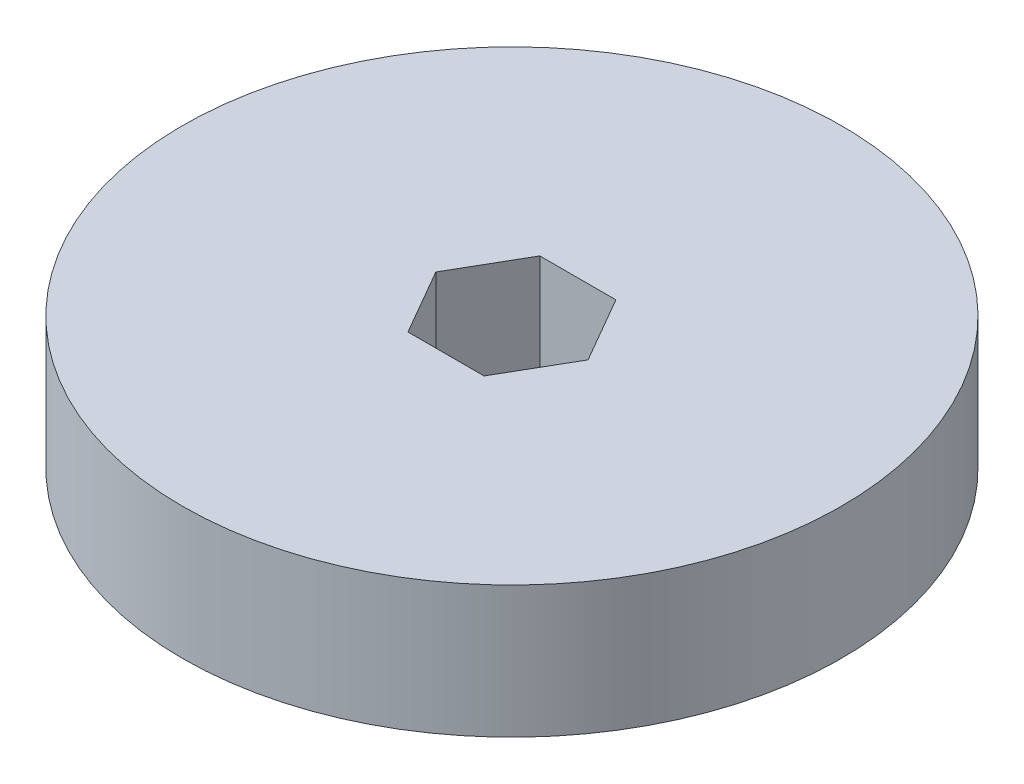
ISO-10303-21;
HEADER;
FILE_DESCRIPTION(('STEP AP214'),'2;1');
FILE_NAME('part.step','',(''),(''),'','','');
FILE_SCHEMA(('AUTOMOTIVE_DESIGN { 1 0 10303 214 1 1 1 1 }'));
ENDSEC;
DATA;
#1=APPLICATION_CONTEXT('core data for automotive mechanical design processes');
#2=APPLICATION_PROTOCOL_DEFINITION('international standard','automotive_design',2000,#1);
#3=PRODUCT_CONTEXT('',#1,'mechanical');
#4=PRODUCT('Part','Part','',(#3));
#5=PRODUCT_RELATED_PRODUCT_CATEGORY('part','',(#4));
#6=PRODUCT_DEFINITION_FORMATION('','',#4);
#7=PRODUCT_DEFINITION_CONTEXT('part definition',#1,'design');
#8=PRODUCT_DEFINITION('design','',#6,#7);
#9=PRODUCT_DEFINITION_SHAPE('','',#8);
#10=(LENGTH_UNIT() NAMED_UNIT(*) SI_UNIT(.MILLI.,.METRE.));
#11=(NAMED_UNIT(*) PLANE_ANGLE_UNIT() SI_UNIT($,.RADIAN.));
#12=(NAMED_UNIT(*) SI_UNIT($,.STERADIAN.) SOLID_ANGLE_UNIT());
#13=UNCERTAINTY_MEASURE_WITH_UNIT(LENGTH_MEASURE(1.E-05),#10,'distance_accuracy_value','');
#14=(GEOMETRIC_REPRESENTATION_CONTEXT(3) GLOBAL_UNCERTAINTY_ASSIGNED_CONTEXT((#13)) GLOBAL_UNIT_ASSIGNED_CONTEXT((#10,
#11,#12)) REPRESENTATION_CONTEXT('',''));
#15=CARTESIAN_POINT('',(0.,0.,0.));
#16=DIRECTION('',(0.,0.,1.));
#17=DIRECTION('',(1.,0.,0.));
#18=AXIS2_PLACEMENT_3D('',#15,#16,#17);
#19=CARTESIAN_POINT('',(0.,12.7,0.));
#20=DIRECTION('',(0.,1.,0.));
#21=DIRECTION('',(0.,0.,1.));
#22=AXIS2_PLACEMENT_3D('',#19,#20,#21);
#23=PLANE('',#22);
#24=CARTESIAN_POINT('',(0.,12.7,0.));
#25=DIRECTION('',(0.,1.,0.));
#26=DIRECTION('',(0.,0.,1.));
#27=AXIS2_PLACEMENT_3D('',#24,#25,#26);
#28=CIRCLE('',#27,31.75);
#29=CARTESIAN_POINT('',(0.,12.7,31.75));
#30=VERTEX_POINT('',#29);
#31=EDGE_CURVE('E11',#30,#30,#28,.T.);
#32=ORIENTED_EDGE('',*,*,#31,.T.);
#33=EDGE_LOOP('',(#32));
#34=FACE_BOUND('',#33,.T.);
#35=DIRECTION('',(0.5,0.,0.866025403784439));
#36=VECTOR('',#35,1.);
#37=CARTESIAN_POINT('',(-7.33234841870825,12.7,0.));
#38=LINE('',#37,#36);
#39=CARTESIAN_POINT('',(-7.33234841870825,12.7,0.));
#40=VERTEX_POINT('',#39);
#41=CARTESIAN_POINT('',(-3.66617420935413,12.7,6.35));
#42=VERTEX_POINT('',#41);
#43=EDGE_CURVE('E93',#40,#42,#38,.T.);
#44=ORIENTED_EDGE('',*,*,#43,.F.);
#45=DIRECTION('',(-0.5,0.,0.866025403784439));
#46=VECTOR('',#45,1.);
#47=CARTESIAN_POINT('',(-3.66617420935413,12.7,-6.35));
#48=LINE('',#47,#46);
#49=CARTESIAN_POINT('',(-3.66617420935413,12.7,-6.35));
#50=VERTEX_POINT('',#49);
#51=EDGE_CURVE('E85',#50,#40,#48,.T.);
#52=ORIENTED_EDGE('',*,*,#51,.F.);
#53=DIRECTION('',(-1.,0.,0.));
#54=VECTOR('',#53,1.);
#55=CARTESIAN_POINT('',(3.66617420935412,12.7,-6.35));
#56=LINE('',#55,#54);
#57=CARTESIAN_POINT('',(3.66617420935412,12.7,-6.35));
#58=VERTEX_POINT('',#57);
#59=EDGE_CURVE('E113',#58,#50,#56,.T.);
#60=ORIENTED_EDGE('',*,*,#59,.F.);
#61=DIRECTION('',(-0.5,0.,-0.866025403784439));
#62=VECTOR('',#61,1.);
#63=CARTESIAN_POINT('',(7.33234841870824,12.7,0.));
#64=LINE('',#63,#62);
#65=CARTESIAN_POINT('',(7.33234841870824,12.7,0.));
#66=VERTEX_POINT('',#65);
#67=EDGE_CURVE('E111',#66,#58,#64,.T.);
#68=ORIENTED_EDGE('',*,*,#67,.F.);
#69=DIRECTION('',(0.5,0.,-0.866025403784439));
#70=VECTOR('',#69,1.);
#71=CARTESIAN_POINT('',(3.66617420935412,12.7,6.35));
#72=LINE('',#71,#70);
#73=CARTESIAN_POINT('',(3.66617420935412,12.7,6.35));
#74=VERTEX_POINT('',#73);
#75=EDGE_CURVE('E107',#74,#66,#72,.T.);
#76=ORIENTED_EDGE('',*,*,#75,.F.);
#77=DIRECTION('',(1.,0.,0.));
#78=VECTOR('',#77,1.);
#79=CARTESIAN_POINT('',(-3.66617420935413,12.7,6.35));
#80=LINE('',#79,#78);
#81=EDGE_CURVE('E105',#42,#74,#80,.T.);
#82=ORIENTED_EDGE('',*,*,#81,.F.);
#83=EDGE_LOOP('',(#44,#52,#60,#68,#76,#82));
#84=FACE_BOUND('',#83,.T.);
#85=ADVANCED_FACE('F32',(#34,#84),#23,.T.);
#86=CARTESIAN_POINT('',(0.,0.,0.));
#87=DIRECTION('',(0.,1.,0.));
#88=DIRECTION('',(0.,0.,1.));
#89=AXIS2_PLACEMENT_3D('',#86,#87,#88);
#90=PLANE('',#89);
#91=CARTESIAN_POINT('',(0.,0.,0.));
#92=DIRECTION('',(0.,1.,0.));
#93=DIRECTION('',(0.,0.,1.));
#94=AXIS2_PLACEMENT_3D('',#91,#92,#93);
#95=CIRCLE('',#94,31.75);
#96=CARTESIAN_POINT('',(0.,0.,31.75));
#97=VERTEX_POINT('',#96);
#98=EDGE_CURVE('E36',#97,#97,#95,.T.);
#99=ORIENTED_EDGE('',*,*,#98,.F.);
#100=EDGE_LOOP('',(#99));
#101=FACE_BOUND('',#100,.T.);
#102=DIRECTION('',(-0.5,0.,0.866025403784439));
#103=VECTOR('',#102,1.);
#104=CARTESIAN_POINT('',(-3.66617420935413,0.,-6.35));
#105=LINE('',#104,#103);
#106=CARTESIAN_POINT('',(-3.66617420935413,0.,-6.35));
#107=VERTEX_POINT('',#106);
#108=CARTESIAN_POINT('',(-7.33234841870825,0.,0.));
#109=VERTEX_POINT('',#108);
#110=EDGE_CURVE('E55',#107,#109,#105,.T.);
#111=ORIENTED_EDGE('',*,*,#110,.T.);
#112=DIRECTION('',(0.5,0.,0.866025403784439));
#113=VECTOR('',#112,1.);
#114=CARTESIAN_POINT('',(-7.33234841870825,0.,0.));
#115=LINE('',#114,#113);
#116=CARTESIAN_POINT('',(-3.66617420935413,0.,6.35));
#117=VERTEX_POINT('',#116);
#118=EDGE_CURVE('E100',#109,#117,#115,.T.);
#119=ORIENTED_EDGE('',*,*,#118,.T.);
#120=DIRECTION('',(1.,0.,0.));
#121=VECTOR('',#120,1.);
#122=CARTESIAN_POINT('',(-3.66617420935413,0.,6.35));
#123=LINE('',#122,#121);
#124=CARTESIAN_POINT('',(3.66617420935412,0.,6.35));
#125=VERTEX_POINT('',#124);
#126=EDGE_CURVE('E117',#117,#125,#123,.T.);
#127=ORIENTED_EDGE('',*,*,#126,.T.);
#128=DIRECTION('',(0.5,0.,-0.866025403784439));
#129=VECTOR('',#128,1.);
#130=CARTESIAN_POINT('',(3.66617420935412,0.,6.35));
#131=LINE('',#130,#129);
#132=CARTESIAN_POINT('',(7.33234841870824,0.,0.));
#133=VERTEX_POINT('',#132);
#134=EDGE_CURVE('E120',#125,#133,#131,.T.);
#135=ORIENTED_EDGE('',*,*,#134,.T.);
#136=DIRECTION('',(-0.5,0.,-0.866025403784439));
#137=VECTOR('',#136,1.);
#138=CARTESIAN_POINT('',(7.33234841870824,0.,0.));
#139=LINE('',#138,#137);
#140=CARTESIAN_POINT('',(3.66617420935412,0.,-6.35));
#141=VERTEX_POINT('',#140);
#142=EDGE_CURVE('E123',#133,#141,#139,.T.);
#143=ORIENTED_EDGE('',*,*,#142,.T.);
#144=DIRECTION('',(-1.,0.,0.));
#145=VECTOR('',#144,1.);
#146=CARTESIAN_POINT('',(3.66617420935412,0.,-6.35));
#147=LINE('',#146,#145);
#148=EDGE_CURVE('E94',#141,#107,#147,.T.);
#149=ORIENTED_EDGE('',*,*,#148,.T.);
#150=EDGE_LOOP('',(#111,#119,#127,#135,#143,#149));
#151=FACE_BOUND('',#150,.T.);
#152=ADVANCED_FACE('F140',(#101,#151),#90,.F.);
#153=CARTESIAN_POINT('',(0.,12.7,0.));
#154=DIRECTION('',(0.,-1.,0.));
#155=DIRECTION('',(0.,0.,-1.));
#156=AXIS2_PLACEMENT_3D('',#153,#154,#155);
#157=CYLINDRICAL_SURFACE('',#156,31.75);
#158=ORIENTED_EDGE('',*,*,#31,.F.);
#159=EDGE_LOOP('',(#158));
#160=FACE_BOUND('',#159,.T.);
#161=ORIENTED_EDGE('',*,*,#98,.T.);
#162=EDGE_LOOP('',(#161));
#163=FACE_BOUND('',#162,.T.);
#164=ADVANCED_FACE('F34',(#160,#163),#157,.T.);
#165=CARTESIAN_POINT('',(-3.66617420935413,12.7,-6.35));
#166=DIRECTION('',(0.866025403784439,0.,0.5));
#167=DIRECTION('',(0.5,0.,-0.866025403784439));
#168=AXIS2_PLACEMENT_3D('',#165,#166,#167);
#169=PLANE('',#168);
#170=ORIENTED_EDGE('',*,*,#110,.F.);
#171=DIRECTION('',(0.,-1.,0.));
#172=VECTOR('',#171,1.);
#173=CARTESIAN_POINT('',(-3.66617420935413,12.7,-6.35));
#174=LINE('',#173,#172);
#175=EDGE_CURVE('E89',#50,#107,#174,.T.);
#176=ORIENTED_EDGE('',*,*,#175,.F.);
#177=ORIENTED_EDGE('',*,*,#51,.T.);
#178=DIRECTION('',(0.,-1.,0.));
#179=VECTOR('',#178,1.);
#180=CARTESIAN_POINT('',(-7.33234841870825,12.7,0.));
#181=LINE('',#180,#179);
#182=EDGE_CURVE('E88',#40,#109,#181,.T.);
#183=ORIENTED_EDGE('',*,*,#182,.T.);
#184=EDGE_LOOP('',(#170,#176,#177,#183));
#185=FACE_BOUND('',#184,.T.);
#186=ADVANCED_FACE('F87',(#185),#169,.T.);
#187=CARTESIAN_POINT('',(-7.33234841870825,12.7,0.));
#188=DIRECTION('',(0.866025403784439,0.,-0.5));
#189=DIRECTION('',(-0.5,0.,-0.866025403784439));
#190=AXIS2_PLACEMENT_3D('',#187,#188,#189);
#191=PLANE('',#190);
#192=ORIENTED_EDGE('',*,*,#118,.F.);
#193=ORIENTED_EDGE('',*,*,#182,.F.);
#194=ORIENTED_EDGE('',*,*,#43,.T.);
#195=DIRECTION('',(0.,-1.,0.));
#196=VECTOR('',#195,1.);
#197=CARTESIAN_POINT('',(-3.66617420935413,12.7,6.35));
#198=LINE('',#197,#196);
#199=EDGE_CURVE('E101',#42,#117,#198,.T.);
#200=ORIENTED_EDGE('',*,*,#199,.T.);
#201=EDGE_LOOP('',(#192,#193,#194,#200));
#202=FACE_BOUND('',#201,.T.);
#203=ADVANCED_FACE('F97',(#202),#191,.T.);
#204=CARTESIAN_POINT('',(-3.66617420935413,12.7,6.35));
#205=DIRECTION('',(0.,0.,-1.));
#206=DIRECTION('',(-1.,0.,0.));
#207=AXIS2_PLACEMENT_3D('',#204,#205,#206);
#208=PLANE('',#207);
#209=ORIENTED_EDGE('',*,*,#126,.F.);
#210=ORIENTED_EDGE('',*,*,#199,.F.);
#211=ORIENTED_EDGE('',*,*,#81,.T.);
#212=DIRECTION('',(0.,-1.,0.));
#213=VECTOR('',#212,1.);
#214=CARTESIAN_POINT('',(3.66617420935412,12.7,6.35));
#215=LINE('',#214,#213);
#216=EDGE_CURVE('E132',#74,#125,#215,.T.);
#217=ORIENTED_EDGE('',*,*,#216,.T.);
#218=EDGE_LOOP('',(#209,#210,#211,#217));
#219=FACE_BOUND('',#218,.T.);
#220=ADVANCED_FACE('F136',(#219),#208,.T.);
#221=CARTESIAN_POINT('',(3.66617420935412,12.7,6.35));
#222=DIRECTION('',(-0.866025403784439,0.,-0.5));
#223=DIRECTION('',(-0.5,0.,0.866025403784439));
#224=AXIS2_PLACEMENT_3D('',#221,#222,#223);
#225=PLANE('',#224);
#226=ORIENTED_EDGE('',*,*,#134,.F.);
#227=ORIENTED_EDGE('',*,*,#216,.F.);
#228=ORIENTED_EDGE('',*,*,#75,.T.);
#229=DIRECTION('',(0.,-1.,0.));
#230=VECTOR('',#229,1.);
#231=CARTESIAN_POINT('',(7.33234841870824,12.7,0.));
#232=LINE('',#231,#230);
#233=EDGE_CURVE('E130',#66,#133,#232,.T.);
#234=ORIENTED_EDGE('',*,*,#233,.T.);
#235=EDGE_LOOP('',(#226,#227,#228,#234));
#236=FACE_BOUND('',#235,.T.);
#237=ADVANCED_FACE('F148',(#236),#225,.T.);
#238=CARTESIAN_POINT('',(7.33234841870824,12.7,0.));
#239=DIRECTION('',(-0.866025403784439,0.,0.5));
#240=DIRECTION('',(0.5,0.,0.866025403784439));
#241=AXIS2_PLACEMENT_3D('',#238,#239,#240);
#242=PLANE('',#241);
#243=ORIENTED_EDGE('',*,*,#142,.F.);
#244=ORIENTED_EDGE('',*,*,#233,.F.);
#245=ORIENTED_EDGE('',*,*,#67,.T.);
#246=DIRECTION('',(0.,-1.,0.));
#247=VECTOR('',#246,1.);
#248=CARTESIAN_POINT('',(3.66617420935412,12.7,-6.35));
#249=LINE('',#248,#247);
#250=EDGE_CURVE('E47',#58,#141,#249,.T.);
#251=ORIENTED_EDGE('',*,*,#250,.T.);
#252=EDGE_LOOP('',(#243,#244,#245,#251));
#253=FACE_BOUND('',#252,.T.);
#254=ADVANCED_FACE('F146',(#253),#242,.T.);
#255=CARTESIAN_POINT('',(3.66617420935412,12.7,-6.35));
#256=DIRECTION('',(0.,0.,1.));
#257=DIRECTION('',(1.,0.,0.));
#258=AXIS2_PLACEMENT_3D('',#255,#256,#257);
#259=PLANE('',#258);
#260=ORIENTED_EDGE('',*,*,#148,.F.);
#261=ORIENTED_EDGE('',*,*,#250,.F.);
#262=ORIENTED_EDGE('',*,*,#59,.T.);
#263=ORIENTED_EDGE('',*,*,#175,.T.);
#264=EDGE_LOOP('',(#260,#261,#262,#263));
#265=FACE_BOUND('',#264,.T.);
#266=ADVANCED_FACE('F142',(#265),#259,.T.);
#267=CLOSED_SHELL('',(#85,#152,#164,#186,#203,#220,#237,#254,#266));
#268=MANIFOLD_SOLID_BREP('B2',#267);
#269=ADVANCED_BREP_SHAPE_REPRESENTATION('',(#18,#268),#14);
#270=SHAPE_DEFINITION_REPRESENTATION(#9,#269);
ENDSEC;
END-ISO-10303-21;
